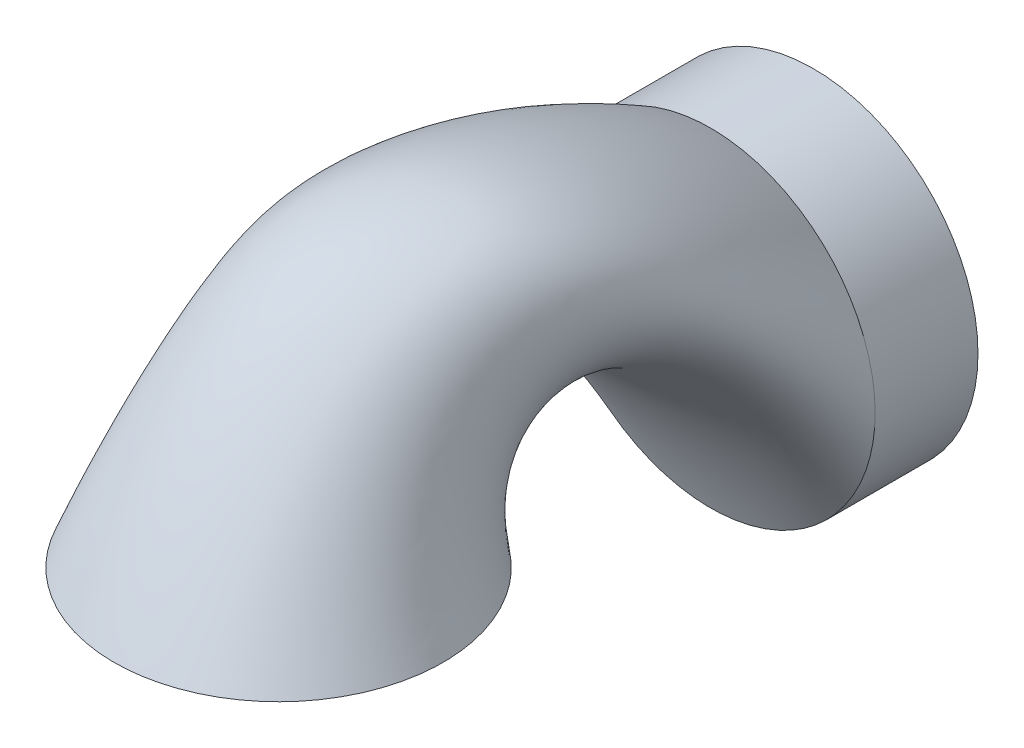
ISO-10303-21;
HEADER;
FILE_DESCRIPTION(('STEP AP214'),'2;1');
FILE_NAME('part.step','',(''),(''),'','','');
FILE_SCHEMA(('AUTOMOTIVE_DESIGN { 1 0 10303 214 1 1 1 1 }'));
ENDSEC;
DATA;
#1=APPLICATION_CONTEXT('core data for automotive mechanical design processes');
#2=APPLICATION_PROTOCOL_DEFINITION('international standard','automotive_design',2000,#1);
#3=PRODUCT_CONTEXT('',#1,'mechanical');
#4=PRODUCT('Part','Part','',(#3));
#5=PRODUCT_RELATED_PRODUCT_CATEGORY('part','',(#4));
#6=PRODUCT_DEFINITION_FORMATION('','',#4);
#7=PRODUCT_DEFINITION_CONTEXT('part definition',#1,'design');
#8=PRODUCT_DEFINITION('design','',#6,#7);
#9=PRODUCT_DEFINITION_SHAPE('','',#8);
#10=(LENGTH_UNIT() NAMED_UNIT(*) SI_UNIT(.MILLI.,.METRE.));
#11=(NAMED_UNIT(*) PLANE_ANGLE_UNIT() SI_UNIT($,.RADIAN.));
#12=(NAMED_UNIT(*) SI_UNIT($,.STERADIAN.) SOLID_ANGLE_UNIT());
#13=UNCERTAINTY_MEASURE_WITH_UNIT(LENGTH_MEASURE(1.E-05),#10,'distance_accuracy_value','');
#14=(GEOMETRIC_REPRESENTATION_CONTEXT(3) GLOBAL_UNCERTAINTY_ASSIGNED_CONTEXT((#13)) GLOBAL_UNIT_ASSIGNED_CONTEXT((#10,
#11,#12)) REPRESENTATION_CONTEXT('',''));
#15=CARTESIAN_POINT('',(0.,0.,0.));
#16=DIRECTION('',(0.,0.,1.));
#17=DIRECTION('',(1.,0.,0.));
#18=AXIS2_PLACEMENT_3D('',#15,#16,#17);
#19=CARTESIAN_POINT('',(0.,0.,260.));
#20=DIRECTION('',(0.,-1.,0.));
#21=DIRECTION('',(0.,0.,1.));
#22=AXIS2_PLACEMENT_3D('',#19,#20,#21);
#23=PLANE('',#22);
#24=CARTESIAN_POINT('',(0.,0.,260.));
#25=DIRECTION('',(0.,-1.,0.));
#26=DIRECTION('',(0.,0.,1.));
#27=AXIS2_PLACEMENT_3D('',#24,#25,#26);
#28=CIRCLE('',#27,10.);
#29=CARTESIAN_POINT('',(0.,0.,270.));
#30=VERTEX_POINT('',#29);
#31=EDGE_CURVE('E112',#30,#30,#28,.T.);
#32=ORIENTED_EDGE('',*,*,#31,.F.);
#33=EDGE_LOOP('',(#32));
#34=FACE_BOUND('',#33,.T.);
#35=CARTESIAN_POINT('',(78.4955339615384,5.48131384018477E-13,244.558136508408));
#36=CARTESIAN_POINT('',(78.2907679151548,5.46701510358923E-13,243.517250467884));
#37=CARTESIAN_POINT('',(77.8407206554618,5.43558847141292E-13,241.447868670442));
#38=CARTESIAN_POINT('',(77.0461181703535,5.38010167644184E-13,238.383994638859));
#39=CARTESIAN_POINT('',(76.1339979948852,5.31640866501324E-13,235.363347085615));
#40=CARTESIAN_POINT('',(69.9682542311678,4.88585707919109E-13,217.516987518738));
#41=CARTESIAN_POINT('',(58.6786225704238,4.09750631387308E-13,203.035847137751));
#42=CARTESIAN_POINT('',(26.9694972149722,1.88326992488114E-13,181.751706899031));
#43=CARTESIAN_POINT('',(5.37585731888476,0.,177.40914511079));
#44=CARTESIAN_POINT('',(-36.2595843020694,-2.53199323889769E-13,185.599786966134));
#45=CARTESIAN_POINT('',(-54.59924839128,-3.8126451374603E-13,197.798141278971));
#46=CARTESIAN_POINT('',(-78.2482931009694,-5.46404910316725E-13,233.030502785028));
#47=CARTESIAN_POINT('',(-82.5908548892102,-5.76728857209558E-13,254.624142681115));
#48=CARTESIAN_POINT('',(-74.4002130338665,-5.19533910827397E-13,296.259584302069));
#49=CARTESIAN_POINT('',(-62.2018587210295,-4.34353257931663E-13,314.59924839128));
#50=CARTESIAN_POINT('',(-26.9694972149722,-1.88326992488114E-13,338.248293100969));
#51=CARTESIAN_POINT('',(-5.37585731888471,0.,342.59085488921));
#52=CARTESIAN_POINT('',(36.2595843020695,2.5319932388977E-13,334.400213033867));
#53=CARTESIAN_POINT('',(54.59924839128,3.8126451374603E-13,322.201858721029));
#54=CARTESIAN_POINT('',(75.8833886300005,5.29890870659656E-13,290.492733365578));
#55=CARTESIAN_POINT('',(80.8464994463279,5.64548088255291E-13,272.814307508224));
#56=CARTESIAN_POINT('',(79.7928337689043,5.57190380155083E-13,253.962285479001));
#57=CARTESIAN_POINT('',(79.4928054067643,5.55095293300012E-13,250.821225492734));
#58=CARTESIAN_POINT('',(79.0676426871096,5.5212639789672E-13,247.684674225407));
#59=CARTESIAN_POINT('',(78.700300007922,5.49561257678031E-13,245.599022548932));
#60=CARTESIAN_POINT('',(78.4955339615384,5.48131384018477E-13,244.558136508408));
#61=B_SPLINE_CURVE_WITH_KNOTS('',3,(#35,#36,#37,#38,#39,#40,#41,#42,#43,#44,#45,#46,#47,#48,#49,
#50,#51,#52,#53,#54,#55,#56,#57,#58,#59,#60),.UNSPECIFIED.,.T.,.F.,(4,1,1,1,1,2,2,2,2,2,2,2,1,1,
1,1,4),(0.,0.00624999999999998,0.0125,0.01875,0.025,0.125,0.25,0.375,0.5,0.625,0.75,0.875,0.975,
0.98125,0.9875,0.99375,1.),.UNSPECIFIED.);
#62=CARTESIAN_POINT('',(78.4955339615384,5.48131384018477E-13,244.558136508408));
#63=VERTEX_POINT('',#62);
#64=EDGE_CURVE('E12',#63,#63,#61,.F.);
#65=ORIENTED_EDGE('',*,*,#64,.T.);
#66=EDGE_LOOP('',(#65));
#67=FACE_BOUND('',#66,.T.);
#68=ADVANCED_FACE('F93',(#34,#67),#23,.T.);
#69=CARTESIAN_POINT('',(4.26953224874635,-79.8859880978943,50.));
#70=CARTESIAN_POINT('',(5.40803254685848,-14.8864967258293,77.322890550166));
#71=CARTESIAN_POINT('',(20.8708605921503,67.2871101782573,142.862852188948));
#72=CARTESIAN_POINT('',(54.8920336887199,38.3708286727672,207.028314889105));
#73=CARTESIAN_POINT('',(78.4955339615384,5.48131384018477E-13,244.558136508408));
#74=CARTESIAN_POINT('',(5.32885633571029,-79.829372182402,50.));
#75=CARTESIAN_POINT('',(6.42832807001963,-14.6441429786696,77.3502669671448));
#76=CARTESIAN_POINT('',(21.6119226357277,67.6297391937635,142.922886307422));
#77=CARTESIAN_POINT('',(55.3422889603812,38.5754162891627,207.750023243935));
#78=CARTESIAN_POINT('',(78.700300007922,5.49561257678031E-13,245.599022548932));
#79=CARTESIAN_POINT('',(7.4409245517987,-79.674287011841,50.));
#80=CARTESIAN_POINT('',(8.46017314715555,-14.1237306150251,77.4185655402452));
#81=CARTESIAN_POINT('',(23.0810310547012,68.3342614998002,143.065428214858));
#82=CARTESIAN_POINT('',(56.2114821812549,38.9924753540671,209.208152861335));
#83=CARTESIAN_POINT('',(79.0676426871096,5.5212639789672E-13,247.684674225407));
#84=CARTESIAN_POINT('',(10.5860064546744,-79.3176681467284,50.));
#85=CARTESIAN_POINT('',(11.4790332176657,-13.2410255995357,77.5611133501286));
#86=CARTESIAN_POINT('',(25.2462921762507,69.450516096425,143.341974189649));
#87=CARTESIAN_POINT('',(57.4168288854397,39.6374019147449,211.442002714499));
#88=CARTESIAN_POINT('',(79.4928054067643,5.55095293300012E-13,250.821225492734));
#89=CARTESIAN_POINT('',(13.7047873885544,-78.838627081803,50.));
#90=CARTESIAN_POINT('',(14.4654211743964,-12.2575941343284,77.7441129647479));
#91=CARTESIAN_POINT('',(27.3706430779184,70.6236834211564,143.680524451205));
#92=CARTESIAN_POINT('',(58.5242363518815,40.3015476264979,213.718875969738));
#93=CARTESIAN_POINT('',(79.7928337689043,5.57190380155083E-13,253.962285479001));
#94=CARTESIAN_POINT('',(32.2399838914294,-75.2392609501235,50.));
#95=CARTESIAN_POINT('',(32.1713843397181,-5.76795222176544,79.0772835872697));
#96=CARTESIAN_POINT('',(39.8627330598032,77.9990454907184,146.078782468974));
#97=CARTESIAN_POINT('',(64.5727397177278,44.3900084304569,227.622446493432));
#98=CARTESIAN_POINT('',(80.8464994463279,5.64548088255291E-13,272.814307508224));
#99=CARTESIAN_POINT('',(48.1625911498115,-66.0943285903715,50.));
#100=CARTESIAN_POINT('',(46.9628938766401,5.01321688540002,82.409726541652));
#101=CARTESIAN_POINT('',(49.5010144198492,87.5062739253335,151.102860640332));
#102=CARTESIAN_POINT('',(65.5531217737834,49.1338011999148,242.655032044157));
#103=CARTESIAN_POINT('',(75.8833886300005,5.29890870659656E-13,290.492733365578));
#104=CARTESIAN_POINT('',(73.6873740633676,-37.6871338375437,50.));
#105=CARTESIAN_POINT('',(69.7070053503255,33.5140042079085,91.8163247945039));
#106=CARTESIAN_POINT('',(62.966283469,110.841992029084,166.477158596075));
#107=CARTESIAN_POINT('',(56.8444679309955,58.5666368651044,273.388209868374));
#108=CARTESIAN_POINT('',(54.59924839128,3.8126451374603E-13,322.201858721029));
#109=CARTESIAN_POINT('',(81.0183064077395,-16.9169494905324,50.));
#110=CARTESIAN_POINT('',(75.225477397006,51.9949487561183,98.6739212070652));
#111=CARTESIAN_POINT('',(64.660170208513,124.670730661095,177.485644474515));
#112=CARTESIAN_POINT('',(45.4837311420193,63.3815156091533,288.257571394563));
#113=CARTESIAN_POINT('',(36.2595843020695,2.5319932388977E-13,334.400213033867));
#114=CARTESIAN_POINT('',(78.7536697880491,25.4560139880249,50.));
#115=CARTESIAN_POINT('',(71.0599089910118,87.0643777040558,110.750349708148));
#116=CARTESIAN_POINT('',(55.0939821895278,147.666170083478,201.111268947305));
#117=CARTESIAN_POINT('',(14.8761557709292,69.985101186026,305.827411469368));
#118=CARTESIAN_POINT('',(-5.37585731888471,0.,342.59085488921));
#119=CARTESIAN_POINT('',(69.2506835629079,45.3265041594163,50.));
#120=CARTESIAN_POINT('',(61.4684512772584,101.920573143629,115.96918179667));
#121=CARTESIAN_POINT('',(43.9392010935365,155.812193962346,212.318355413418));
#122=CARTESIAN_POINT('',(-2.66854517552861,71.7738080188499,308.193040687235));
#123=CARTESIAN_POINT('',(-26.9694972149722,-1.88326992488114E-13,338.248293100969));
#124=CARTESIAN_POINT('',(37.6871338375436,73.6873740633676,50.));
#125=CARTESIAN_POINT('',(31.8699401578198,121.133798103996,122.29012232748));
#126=CARTESIAN_POINT('',(13.8119970438368,161.033453975953,228.939204558537));
#127=CARTESIAN_POINT('',(-34.7325122803619,71.9379777469182,298.631291098414));
#128=CARTESIAN_POINT('',(-62.2018587210295,-4.34353257931663E-13,314.59924839128));
#129=CARTESIAN_POINT('',(16.9169494905324,81.0183064077395,50.));
#130=CARTESIAN_POINT('',(13.1532659053466,124.331380236602,123.392230769768));
#131=CARTESIAN_POINT('',(-4.04776178893525,158.024925691122,233.179888708378));
#132=CARTESIAN_POINT('',(-47.8114111416045,70.3134406421627,287.670731123962));
#133=CARTESIAN_POINT('',(-74.4002130338665,-5.19533910827397E-13,296.259584302069));
#134=CARTESIAN_POINT('',(-25.4560139880249,78.753669788049,50.));
#135=CARTESIAN_POINT('',(-24.9631018774723,117.705397243126,119.436799509511));
#136=CARTESIAN_POINT('',(-36.645415215833,141.075127003699,233.931943098186));
#137=CARTESIAN_POINT('',(-62.9664271142439,65.2086860403718,255.74745047744));
#138=CARTESIAN_POINT('',(-82.5908548892102,-5.76728857209558E-13,254.624142681115));
#139=CARTESIAN_POINT('',(-45.3265041594164,69.2506835629079,50.));
#140=CARTESIAN_POINT('',(-42.6305064476634,107.974414855966,114.379259806965));
#141=CARTESIAN_POINT('',(-49.9150587822709,128.03607273441,230.194381900716));
#142=CARTESIAN_POINT('',(-64.7076948948931,61.7284685433363,236.486867441025));
#143=CARTESIAN_POINT('',(-78.2482931009694,-5.46404910316725E-13,233.030502785028));
#144=CARTESIAN_POINT('',(-73.6873740633677,37.6871338375435,50.));
#145=CARTESIAN_POINT('',(-70.6872697817805,76.3759123825365,103.517443128624));
#146=CARTESIAN_POINT('',(-61.9265687932177,102.025327674486,213.521219080396));
#147=CARTESIAN_POINT('',(-57.8325235141943,51.3299804281977,201.962264870563));
#148=CARTESIAN_POINT('',(-54.59924839128,-3.8126451374603E-13,197.798141278971));
#149=CARTESIAN_POINT('',(-81.0183064077395,16.9169494905323,50.));
#150=CARTESIAN_POINT('',(-79.9171811575187,55.7987714494796,97.713166152827));
#151=CARTESIAN_POINT('',(-59.704678842339,90.4133275953282,201.406653771788));
#152=CARTESIAN_POINT('',(-50.1829031850842,44.4117098100946,188.138612633649));
#153=CARTESIAN_POINT('',(-36.2595843020694,-2.53199323889769E-13,185.599786966134));
#154=CARTESIAN_POINT('',(-78.753669788049,-25.456013988025,50.));
#155=CARTESIAN_POINT('',(-78.3057079499481,17.6843556787604,88.637476602639));
#156=CARTESIAN_POINT('',(-47.4540159239362,70.6300158242307,174.627559331678));
#157=CARTESIAN_POINT('',(-22.1144864473132,34.7641269831404,173.551318173099));
#158=CARTESIAN_POINT('',(5.37585731888476,0.,177.40914511079));
#159=CARTESIAN_POINT('',(-69.2506835629078,-45.3265041594164,50.));
#160=CARTESIAN_POINT('',(-67.5569061055606,1.8793698012528,85.3660640282477));
#161=CARTESIAN_POINT('',(-37.5305366189189,63.4793810437938,161.373082328414));
#162=CARTESIAN_POINT('',(-3.39782767430838,32.0348147742893,173.122525280211));
#163=CARTESIAN_POINT('',(26.9694972149722,1.88326992488114E-13,181.751706899031));
#164=CARTESIAN_POINT('',(-40.8434888100798,-70.8512870729726,50.));
#165=CARTESIAN_POINT('',(-38.5165428546018,-15.4457775468887,79.9501697990961));
#166=CARTESIAN_POINT('',(-12.9224721742584,58.8261958312843,146.101672483701));
#167=CARTESIAN_POINT('',(27.8216984022682,31.8381934083528,182.036475902175));
#168=CARTESIAN_POINT('',(58.6786225704238,4.09750631387308E-13,203.035847137751));
#169=CARTESIAN_POINT('',(-24.0368617274562,-78.2469950089812,50.));
#170=CARTESIAN_POINT('',(-22.0188771696546,-18.636338172136,77.5712202549033));
#171=CARTESIAN_POINT('',(0.489805074054548,59.7903798566563,142.931711877747));
#172=CARTESIAN_POINT('',(40.6515178396645,33.5269975493255,189.247476292087));
#173=CARTESIAN_POINT('',(69.9682542311678,4.88585707919109E-13,217.516987518738));
#174=CARTESIAN_POINT('',(-5.22360886715542,-79.8502612889404,50.));
#175=CARTESIAN_POINT('',(-3.76314386057567,-16.5907453817065,77.2498163213582));
#176=CARTESIAN_POINT('',(14.1307412544859,64.5045755503889,142.608031210047));
#177=CARTESIAN_POINT('',(50.4752406462349,36.6428100637717,200.825454737638));
#178=CARTESIAN_POINT('',(76.1339979948852,5.31640866501324E-13,235.363347085615));
#179=CARTESIAN_POINT('',(-2.0715350106808,-79.9941545088918,50.));
#180=CARTESIAN_POINT('',(-0.711303870137301,-16.1389916171596,77.2323930713925));
#181=CARTESIAN_POINT('',(16.3933603957878,65.358998889842,142.623046571901));
#182=CARTESIAN_POINT('',(52.0338422947261,37.1904343807437,202.821655923699));
#183=CARTESIAN_POINT('',(77.0461181703535,5.38010167644184E-13,238.383994638859));
#184=CARTESIAN_POINT('',(1.09364147481592,-80.0135195911,50.));
#185=CARTESIAN_POINT('',(2.34706145298952,-15.5773901842886,77.2543070383725));
#186=CARTESIAN_POINT('',(18.6420000483757,66.2829984874294,142.703978846826));
#187=CARTESIAN_POINT('',(53.511624797941,37.7649496556939,204.88641342053));
#188=CARTESIAN_POINT('',(77.8407206554618,5.43558847141292E-13,241.447868670442));
#189=CARTESIAN_POINT('',(3.21020816178243,-79.9426040133866,50.));
#190=CARTESIAN_POINT('',(4.38773702369735,-15.128850472989,77.2955141331872));
#191=CARTESIAN_POINT('',(20.129798548573,66.9444811627511,142.802818070474));
#192=CARTESIAN_POINT('',(54.4417784170586,38.1662410563717,206.306606534274));
#193=CARTESIAN_POINT('',(78.2907679151548,5.46701510358923E-13,243.517250467884));
#194=CARTESIAN_POINT('',(4.26953224874635,-79.8859880978943,50.));
#195=CARTESIAN_POINT('',(5.40803254685848,-14.8864967258293,77.322890550166));
#196=CARTESIAN_POINT('',(20.8708605921503,67.2871101782573,142.862852188948));
#197=CARTESIAN_POINT('',(54.8920336887199,38.3708286727672,207.028314889105));
#198=CARTESIAN_POINT('',(78.4955339615384,5.48131384018477E-13,244.558136508408));
#199=B_SPLINE_SURFACE_WITH_KNOTS('',3,3,((#69,#70,#71,#72,#73),(#74,#75,#76,#77,#78),(#79,#80,
#81,#82,#83),(#84,#85,#86,#87,#88),(#89,#90,#91,#92,#93),(#94,#95,#96,#97,#98),(#99,#100,#101,
#102,#103),(#104,#105,#106,#107,#108),(#109,#110,#111,#112,#113),(#114,#115,#116,#117,#118),
(#119,#120,#121,#122,#123),(#124,#125,#126,#127,#128),(#129,#130,#131,#132,#133),(#134,#135,
#136,#137,#138),(#139,#140,#141,#142,#143),(#144,#145,#146,#147,#148),(#149,#150,#151,#152,
#153),(#154,#155,#156,#157,#158),(#159,#160,#161,#162,#163),(#164,#165,#166,#167,#168),(#169,
#170,#171,#172,#173),(#174,#175,#176,#177,#178),(#179,#180,#181,#182,#183),(#184,#185,#186,#187,
#188),(#189,#190,#191,#192,#193),(#194,#195,#196,#197,#198)),.UNSPECIFIED.,.T.,.F.,.F.,(4,1,1,1,
1,2,2,2,2,2,2,2,1,1,1,1,4),(4,1,4),(0.,0.00625000000000009,0.0125,0.01875,0.0249999999999999,
0.125,0.25,0.375,0.5,0.625,0.75,0.875,0.975,0.98125,0.9875,0.99375,1.),(0.,0.581882876866248,
1.),.UNSPECIFIED.);
#200=CARTESIAN_POINT('',(4.26953224874635,-79.8859880978943,50.));
#201=CARTESIAN_POINT('',(5.32885633571029,-79.829372182402,50.));
#202=CARTESIAN_POINT('',(7.4409245517987,-79.674287011841,50.));
#203=CARTESIAN_POINT('',(10.5860064546744,-79.3176681467284,50.));
#204=CARTESIAN_POINT('',(13.7047873885544,-78.838627081803,50.));
#205=CARTESIAN_POINT('',(32.2399838914294,-75.2392609501235,50.));
#206=CARTESIAN_POINT('',(48.1625911498115,-66.0943285903715,50.));
#207=CARTESIAN_POINT('',(73.6873740633676,-37.6871338375437,50.));
#208=CARTESIAN_POINT('',(81.0183064077395,-16.9169494905324,50.));
#209=CARTESIAN_POINT('',(78.7536697880491,25.4560139880249,50.));
#210=CARTESIAN_POINT('',(69.2506835629079,45.3265041594163,50.));
#211=CARTESIAN_POINT('',(37.6871338375436,73.6873740633676,50.));
#212=CARTESIAN_POINT('',(16.9169494905324,81.0183064077395,50.));
#213=CARTESIAN_POINT('',(-25.4560139880249,78.753669788049,50.));
#214=CARTESIAN_POINT('',(-45.3265041594164,69.2506835629079,50.));
#215=CARTESIAN_POINT('',(-73.6873740633677,37.6871338375435,50.));
#216=CARTESIAN_POINT('',(-81.0183064077395,16.9169494905323,50.));
#217=CARTESIAN_POINT('',(-78.753669788049,-25.456013988025,50.));
#218=CARTESIAN_POINT('',(-69.2506835629078,-45.3265041594164,50.));
#219=CARTESIAN_POINT('',(-40.8434888100798,-70.8512870729726,50.));
#220=CARTESIAN_POINT('',(-24.0368617274562,-78.2469950089812,50.));
#221=CARTESIAN_POINT('',(-5.22360886715542,-79.8502612889404,50.));
#222=CARTESIAN_POINT('',(-2.0715350106808,-79.9941545088918,50.));
#223=CARTESIAN_POINT('',(1.09364147481592,-80.0135195911,50.));
#224=CARTESIAN_POINT('',(3.21020816178243,-79.9426040133866,50.));
#225=CARTESIAN_POINT('',(4.26953224874635,-79.8859880978943,50.));
#226=B_SPLINE_CURVE_WITH_KNOTS('',3,(#200,#201,#202,#203,#204,#205,#206,#207,#208,#209,#210,
#211,#212,#213,#214,#215,#216,#217,#218,#219,#220,#221,#222,#223,#224,#225),.UNSPECIFIED.,.T.,
.F.,(4,1,1,1,1,2,2,2,2,2,2,2,1,1,1,1,4),(0.,0.00625000000000009,0.0125,0.01875,
0.0249999999999999,0.125,0.25,0.375,0.5,0.625,0.75,0.875,0.975,0.98125,0.9875,0.99375,1.),.UNSPECIFIED.);
#227=CARTESIAN_POINT('',(4.26953224874635,-79.8859880978943,50.));
#228=VERTEX_POINT('',#227);
#229=EDGE_CURVE('E122',#228,#228,#226,.T.);
#230=ORIENTED_EDGE('',*,*,#229,.T.);
#231=EDGE_LOOP('',(#230));
#232=FACE_BOUND('',#231,.T.);
#233=ORIENTED_EDGE('',*,*,#64,.F.);
#234=EDGE_LOOP('',(#233));
#235=FACE_BOUND('',#234,.T.);
#236=ADVANCED_FACE('F142',(#232,#235),#199,.T.);
#237=CARTESIAN_POINT('',(0.,10.,260.));
#238=DIRECTION('',(0.,-1.,0.));
#239=DIRECTION('',(0.,0.,1.));
#240=AXIS2_PLACEMENT_3D('',#237,#238,#239);
#241=CYLINDRICAL_SURFACE('',#240,10.);
#242=CARTESIAN_POINT('',(0.,10.,260.));
#243=DIRECTION('',(0.,-1.,0.));
#244=DIRECTION('',(0.,0.,1.));
#245=AXIS2_PLACEMENT_3D('',#242,#243,#244);
#246=CIRCLE('',#245,10.);
#247=CARTESIAN_POINT('',(0.,10.,270.));
#248=VERTEX_POINT('',#247);
#249=EDGE_CURVE('E108',#248,#248,#246,.T.);
#250=ORIENTED_EDGE('',*,*,#249,.F.);
#251=EDGE_LOOP('',(#250));
#252=FACE_BOUND('',#251,.T.);
#253=ORIENTED_EDGE('',*,*,#31,.T.);
#254=EDGE_LOOP('',(#253));
#255=FACE_BOUND('',#254,.T.);
#256=ADVANCED_FACE('F148',(#252,#255),#241,.F.);
#257=CARTESIAN_POINT('',(0.,10.,260.));
#258=DIRECTION('',(0.,-1.,0.));
#259=DIRECTION('',(0.,0.,1.));
#260=AXIS2_PLACEMENT_3D('',#257,#258,#259);
#261=PLANE('',#260);
#262=ORIENTED_EDGE('',*,*,#249,.T.);
#263=EDGE_LOOP('',(#262));
#264=FACE_BOUND('',#263,.T.);
#265=ADVANCED_FACE('F137',(#264),#261,.T.);
#266=CARTESIAN_POINT('',(0.,0.,0.));
#267=DIRECTION('',(0.,0.,1.));
#268=DIRECTION('',(-1.,0.,0.));
#269=AXIS2_PLACEMENT_3D('',#266,#267,#268);
#270=CYLINDRICAL_SURFACE('',#269,80.);
#271=CARTESIAN_POINT('',(0.,0.,0.));
#272=DIRECTION('',(0.,0.,-1.));
#273=DIRECTION('',(1.,0.,0.));
#274=AXIS2_PLACEMENT_3D('',#271,#272,#273);
#275=CIRCLE('',#274,80.);
#276=CARTESIAN_POINT('',(80.,5.58637014214901E-13,0.));
#277=VERTEX_POINT('',#276);
#278=EDGE_CURVE('E120',#277,#277,#275,.T.);
#279=ORIENTED_EDGE('',*,*,#278,.F.);
#280=EDGE_LOOP('',(#279));
#281=FACE_BOUND('',#280,.T.);
#282=ORIENTED_EDGE('',*,*,#229,.F.);
#283=EDGE_LOOP('',(#282));
#284=FACE_BOUND('',#283,.T.);
#285=ADVANCED_FACE('F126',(#281,#284),#270,.T.);
#286=CARTESIAN_POINT('',(0.,0.,0.));
#287=DIRECTION('',(0.,0.,-1.));
#288=DIRECTION('',(1.,0.,0.));
#289=AXIS2_PLACEMENT_3D('',#286,#287,#288);
#290=PLANE('',#289);
#291=CARTESIAN_POINT('',(0.,0.,0.));
#292=DIRECTION('',(0.,0.,-1.));
#293=DIRECTION('',(1.,0.,0.));
#294=AXIS2_PLACEMENT_3D('',#291,#292,#293);
#295=CIRCLE('',#294,10.);
#296=CARTESIAN_POINT('',(10.,0.,0.));
#297=VERTEX_POINT('',#296);
#298=EDGE_CURVE('E174',#297,#297,#295,.T.);
#299=ORIENTED_EDGE('',*,*,#298,.F.);
#300=EDGE_LOOP('',(#299));
#301=FACE_BOUND('',#300,.T.);
#302=ORIENTED_EDGE('',*,*,#278,.T.);
#303=EDGE_LOOP('',(#302));
#304=FACE_BOUND('',#303,.T.);
#305=ADVANCED_FACE('F136',(#301,#304),#290,.T.);
#306=CARTESIAN_POINT('',(0.,0.,10.));
#307=DIRECTION('',(0.,0.,-1.));
#308=DIRECTION('',(1.,0.,0.));
#309=AXIS2_PLACEMENT_3D('',#306,#307,#308);
#310=CYLINDRICAL_SURFACE('',#309,10.);
#311=CARTESIAN_POINT('',(0.,0.,10.));
#312=DIRECTION('',(0.,0.,-1.));
#313=DIRECTION('',(1.,0.,0.));
#314=AXIS2_PLACEMENT_3D('',#311,#312,#313);
#315=CIRCLE('',#314,10.);
#316=CARTESIAN_POINT('',(10.,0.,10.));
#317=VERTEX_POINT('',#316);
#318=EDGE_CURVE('E196',#317,#317,#315,.T.);
#319=ORIENTED_EDGE('',*,*,#318,.F.);
#320=EDGE_LOOP('',(#319));
#321=FACE_BOUND('',#320,.T.);
#322=ORIENTED_EDGE('',*,*,#298,.T.);
#323=EDGE_LOOP('',(#322));
#324=FACE_BOUND('',#323,.T.);
#325=ADVANCED_FACE('F151',(#321,#324),#310,.F.);
#326=CARTESIAN_POINT('',(0.,0.,10.));
#327=DIRECTION('',(0.,0.,-1.));
#328=DIRECTION('',(1.,0.,0.));
#329=AXIS2_PLACEMENT_3D('',#326,#327,#328);
#330=PLANE('',#329);
#331=ORIENTED_EDGE('',*,*,#318,.T.);
#332=EDGE_LOOP('',(#331));
#333=FACE_BOUND('',#332,.T.);
#334=ADVANCED_FACE('F191',(#333),#330,.T.);
#335=CLOSED_SHELL('',(#68,#236,#256,#265,#285,#305,#325,#334));
#336=CARTESIAN_POINT('',(0.,0.,60.));
#337=DIRECTION('',(0.,0.,-1.));
#338=DIRECTION('',(1.,0.,0.));
#339=AXIS2_PLACEMENT_3D('',#336,#337,#338);
#340=PLANE('',#339);
#341=CARTESIAN_POINT('',(0.,0.,60.));
#342=DIRECTION('',(0.,0.,-1.));
#343=DIRECTION('',(1.,0.,0.));
#344=AXIS2_PLACEMENT_3D('',#341,#342,#343);
#345=CIRCLE('',#344,10.);
#346=CARTESIAN_POINT('',(10.,0.,60.));
#347=VERTEX_POINT('',#346);
#348=EDGE_CURVE('E103',#347,#347,#345,.T.);
#349=ORIENTED_EDGE('',*,*,#348,.T.);
#350=EDGE_LOOP('',(#349));
#351=FACE_BOUND('',#350,.T.);
#352=ADVANCED_FACE('F160',(#351),#340,.T.);
#353=CARTESIAN_POINT('',(0.,0.,60.));
#354=DIRECTION('',(0.,0.,-1.));
#355=DIRECTION('',(1.,0.,0.));
#356=AXIS2_PLACEMENT_3D('',#353,#354,#355);
#357=CYLINDRICAL_SURFACE('',#356,10.);
#358=ORIENTED_EDGE('',*,*,#348,.F.);
#359=EDGE_LOOP('',(#358));
#360=FACE_BOUND('',#359,.T.);
#361=CARTESIAN_POINT('',(0.,0.,50.));
#362=DIRECTION('',(0.,0.,-1.));
#363=DIRECTION('',(1.,0.,0.));
#364=AXIS2_PLACEMENT_3D('',#361,#362,#363);
#365=CIRCLE('',#364,10.);
#366=CARTESIAN_POINT('',(10.,0.,50.));
#367=VERTEX_POINT('',#366);
#368=EDGE_CURVE('E94',#367,#367,#365,.T.);
#369=ORIENTED_EDGE('',*,*,#368,.T.);
#370=EDGE_LOOP('',(#369));
#371=FACE_BOUND('',#370,.T.);
#372=ADVANCED_FACE('F157',(#360,#371),#357,.F.);
#373=CARTESIAN_POINT('',(0.,0.,50.));
#374=DIRECTION('',(0.,0.,-1.));
#375=DIRECTION('',(1.,0.,0.));
#376=AXIS2_PLACEMENT_3D('',#373,#374,#375);
#377=PLANE('',#376);
#378=ORIENTED_EDGE('',*,*,#368,.F.);
#379=EDGE_LOOP('',(#378));
#380=FACE_BOUND('',#379,.T.);
#381=ADVANCED_FACE('F91',(#380),#377,.F.);
#382=CLOSED_SHELL('',(#352,#372,#381));
#383=ORIENTED_CLOSED_SHELL('',*,#382,.T.);
#384=BREP_WITH_VOIDS('B2',#335,(#383));
#385=ADVANCED_BREP_SHAPE_REPRESENTATION('',(#18,#384),#14);
#386=SHAPE_DEFINITION_REPRESENTATION(#9,#385);
ENDSEC;
END-ISO-10303-21;
